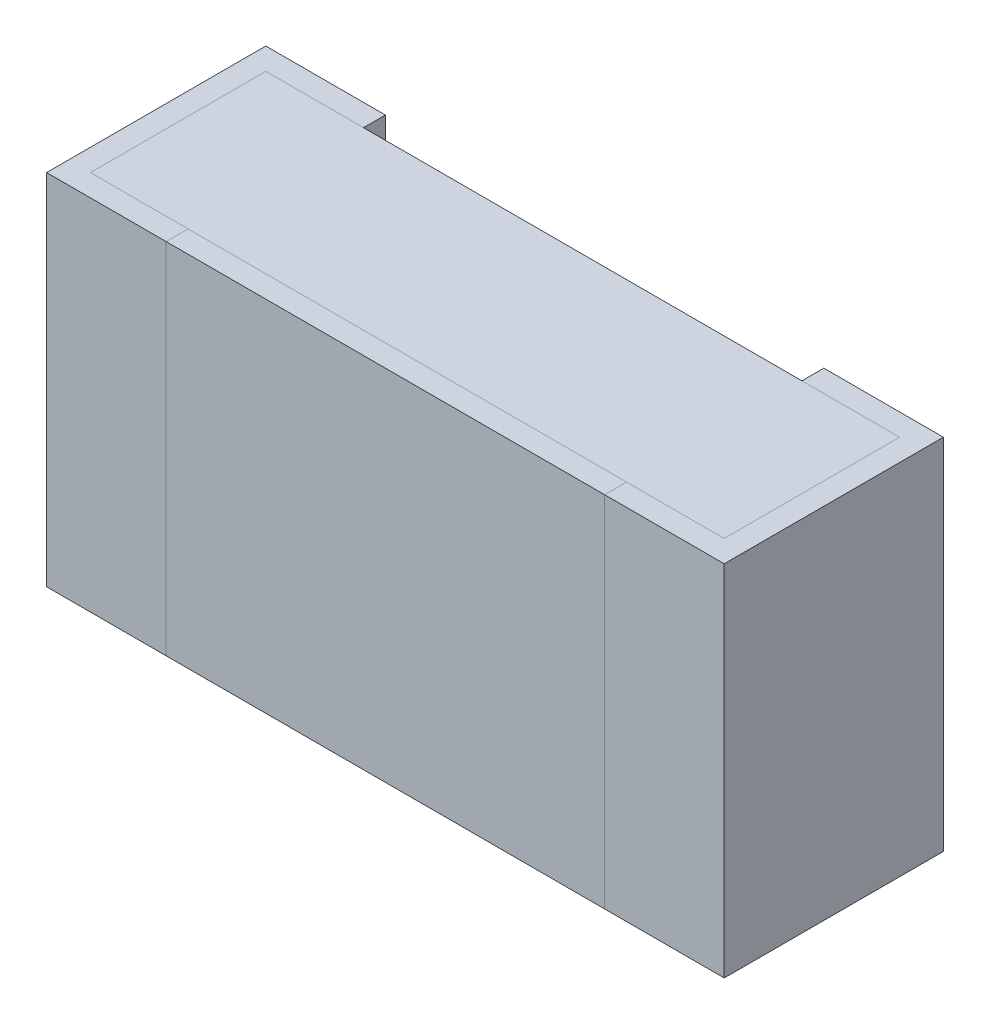
ISO-10303-21;
HEADER;
FILE_DESCRIPTION(('STEP AP214'),'2;1');
FILE_NAME('part.step','',(''),(''),'','','');
FILE_SCHEMA(('AUTOMOTIVE_DESIGN { 1 0 10303 214 1 1 1 1 }'));
ENDSEC;
DATA;
#1=APPLICATION_CONTEXT('core data for automotive mechanical design processes');
#2=APPLICATION_PROTOCOL_DEFINITION('international standard','automotive_design',2000,#1);
#3=PRODUCT_CONTEXT('',#1,'mechanical');
#4=PRODUCT('Part','Part','',(#3));
#5=PRODUCT_RELATED_PRODUCT_CATEGORY('part','',(#4));
#6=PRODUCT_DEFINITION_FORMATION('','',#4);
#7=PRODUCT_DEFINITION_CONTEXT('part definition',#1,'design');
#8=PRODUCT_DEFINITION('design','',#6,#7);
#9=PRODUCT_DEFINITION_SHAPE('','',#8);
#10=(LENGTH_UNIT() NAMED_UNIT(*) SI_UNIT(.MILLI.,.METRE.));
#11=(NAMED_UNIT(*) PLANE_ANGLE_UNIT() SI_UNIT($,.RADIAN.));
#12=(NAMED_UNIT(*) SI_UNIT($,.STERADIAN.) SOLID_ANGLE_UNIT());
#13=UNCERTAINTY_MEASURE_WITH_UNIT(LENGTH_MEASURE(1.E-05),#10,'distance_accuracy_value','');
#14=(GEOMETRIC_REPRESENTATION_CONTEXT(3) GLOBAL_UNCERTAINTY_ASSIGNED_CONTEXT((#13)) GLOBAL_UNIT_ASSIGNED_CONTEXT((#10,
#11,#12)) REPRESENTATION_CONTEXT('',''));
#15=CARTESIAN_POINT('',(0.,0.,0.));
#16=DIRECTION('',(0.,0.,1.));
#17=DIRECTION('',(1.,0.,0.));
#18=AXIS2_PLACEMENT_3D('',#15,#16,#17);
#19=CARTESIAN_POINT('',(-0.795,-0.45,0.055));
#20=DIRECTION('',(1.,0.,0.));
#21=DIRECTION('',(0.,0.,1.));
#22=AXIS2_PLACEMENT_3D('',#19,#20,#21);
#23=PLANE('',#22);
#24=DIRECTION('',(0.,1.,0.));
#25=VECTOR('',#24,1.);
#26=CARTESIAN_POINT('',(-0.795,-0.45,0.495));
#27=LINE('',#26,#25);
#28=CARTESIAN_POINT('',(-0.795,-0.45,0.495));
#29=VERTEX_POINT('',#28);
#30=CARTESIAN_POINT('',(-0.795,0.45,0.495));
#31=VERTEX_POINT('',#30);
#32=EDGE_CURVE('P0_E11',#29,#31,#27,.T.);
#33=ORIENTED_EDGE('',*,*,#32,.T.);
#34=DIRECTION('',(0.,0.,1.));
#35=VECTOR('',#34,1.);
#36=CARTESIAN_POINT('',(-0.795,0.45,0.055));
#37=LINE('',#36,#35);
#38=CARTESIAN_POINT('',(-0.795,0.45,0.055));
#39=VERTEX_POINT('',#38);
#40=EDGE_CURVE('P0_E24',#39,#31,#37,.T.);
#41=ORIENTED_EDGE('',*,*,#40,.F.);
#42=DIRECTION('',(0.,1.,0.));
#43=VECTOR('',#42,1.);
#44=CARTESIAN_POINT('',(-0.795,-0.45,0.055));
#45=LINE('',#44,#43);
#46=CARTESIAN_POINT('',(-0.795,-0.45,0.055));
#47=VERTEX_POINT('',#46);
#48=EDGE_CURVE('P0_E86',#47,#39,#45,.T.);
#49=ORIENTED_EDGE('',*,*,#48,.F.);
#50=DIRECTION('',(0.,0.,1.));
#51=VECTOR('',#50,1.);
#52=CARTESIAN_POINT('',(-0.795,-0.45,0.055));
#53=LINE('',#52,#51);
#54=EDGE_CURVE('P0_E36',#47,#29,#53,.T.);
#55=ORIENTED_EDGE('',*,*,#54,.T.);
#56=EDGE_LOOP('',(#33,#41,#49,#55));
#57=FACE_BOUND('',#56,.T.);
#58=ADVANCED_FACE('P0_F17',(#57),#23,.F.);
#59=CARTESIAN_POINT('',(0.795,-0.45,0.055));
#60=DIRECTION('',(1.,0.,0.));
#61=DIRECTION('',(0.,0.,1.));
#62=AXIS2_PLACEMENT_3D('',#59,#60,#61);
#63=PLANE('',#62);
#64=DIRECTION('',(0.,0.,1.));
#65=VECTOR('',#64,1.);
#66=CARTESIAN_POINT('',(0.795,-0.45,0.055));
#67=LINE('',#66,#65);
#68=CARTESIAN_POINT('',(0.795,-0.45,0.055));
#69=VERTEX_POINT('',#68);
#70=CARTESIAN_POINT('',(0.795,-0.45,0.495));
#71=VERTEX_POINT('',#70);
#72=EDGE_CURVE('P0_E83',#69,#71,#67,.T.);
#73=ORIENTED_EDGE('',*,*,#72,.F.);
#74=DIRECTION('',(0.,1.,0.));
#75=VECTOR('',#74,1.);
#76=CARTESIAN_POINT('',(0.795,-0.45,0.055));
#77=LINE('',#76,#75);
#78=CARTESIAN_POINT('',(0.795,0.45,0.055));
#79=VERTEX_POINT('',#78);
#80=EDGE_CURVE('P0_E63',#69,#79,#77,.T.);
#81=ORIENTED_EDGE('',*,*,#80,.T.);
#82=DIRECTION('',(0.,0.,1.));
#83=VECTOR('',#82,1.);
#84=CARTESIAN_POINT('',(0.795,0.45,0.055));
#85=LINE('',#84,#83);
#86=CARTESIAN_POINT('',(0.795,0.45,0.495));
#87=VERTEX_POINT('',#86);
#88=EDGE_CURVE('P0_E57',#79,#87,#85,.T.);
#89=ORIENTED_EDGE('',*,*,#88,.T.);
#90=DIRECTION('',(0.,1.,0.));
#91=VECTOR('',#90,1.);
#92=CARTESIAN_POINT('',(0.795,-0.45,0.495));
#93=LINE('',#92,#91);
#94=EDGE_CURVE('P0_E60',#71,#87,#93,.T.);
#95=ORIENTED_EDGE('',*,*,#94,.F.);
#96=EDGE_LOOP('',(#73,#81,#89,#95));
#97=FACE_BOUND('',#96,.T.);
#98=ADVANCED_FACE('P0_F59',(#97),#63,.T.);
#99=CARTESIAN_POINT('',(-0.795,-0.45,0.055));
#100=DIRECTION('',(0.,1.,0.));
#101=DIRECTION('',(0.,0.,1.));
#102=AXIS2_PLACEMENT_3D('',#99,#100,#101);
#103=PLANE('',#102);
#104=ORIENTED_EDGE('',*,*,#72,.T.);
#105=DIRECTION('',(1.,0.,0.));
#106=VECTOR('',#105,1.);
#107=CARTESIAN_POINT('',(-0.795,-0.45,0.495));
#108=LINE('',#107,#106);
#109=EDGE_CURVE('P0_E71',#29,#71,#108,.T.);
#110=ORIENTED_EDGE('',*,*,#109,.F.);
#111=ORIENTED_EDGE('',*,*,#54,.F.);
#112=DIRECTION('',(1.,0.,0.));
#113=VECTOR('',#112,1.);
#114=CARTESIAN_POINT('',(-0.795,-0.45,0.055));
#115=LINE('',#114,#113);
#116=EDGE_CURVE('P0_E76',#47,#69,#115,.T.);
#117=ORIENTED_EDGE('',*,*,#116,.T.);
#118=EDGE_LOOP('',(#104,#110,#111,#117));
#119=FACE_BOUND('',#118,.T.);
#120=ADVANCED_FACE('P0_F91',(#119),#103,.F.);
#121=CARTESIAN_POINT('',(-0.795,0.45,0.055));
#122=DIRECTION('',(0.,1.,0.));
#123=DIRECTION('',(0.,0.,1.));
#124=AXIS2_PLACEMENT_3D('',#121,#122,#123);
#125=PLANE('',#124);
#126=DIRECTION('',(1.,0.,0.));
#127=VECTOR('',#126,1.);
#128=CARTESIAN_POINT('',(-0.795,0.45,0.055));
#129=LINE('',#128,#127);
#130=EDGE_CURVE('P0_E74',#39,#79,#129,.T.);
#131=ORIENTED_EDGE('',*,*,#130,.F.);
#132=ORIENTED_EDGE('',*,*,#40,.T.);
#133=DIRECTION('',(1.,0.,0.));
#134=VECTOR('',#133,1.);
#135=CARTESIAN_POINT('',(-0.795,0.45,0.495));
#136=LINE('',#135,#134);
#137=EDGE_CURVE('P0_E69',#31,#87,#136,.T.);
#138=ORIENTED_EDGE('',*,*,#137,.T.);
#139=ORIENTED_EDGE('',*,*,#88,.F.);
#140=EDGE_LOOP('',(#131,#132,#138,#139));
#141=FACE_BOUND('',#140,.T.);
#142=ADVANCED_FACE('P0_F73',(#141),#125,.T.);
#143=CARTESIAN_POINT('',(-0.795,-0.45,0.055));
#144=DIRECTION('',(0.,0.,1.));
#145=DIRECTION('',(1.,0.,0.));
#146=AXIS2_PLACEMENT_3D('',#143,#144,#145);
#147=PLANE('',#146);
#148=ORIENTED_EDGE('',*,*,#130,.T.);
#149=ORIENTED_EDGE('',*,*,#80,.F.);
#150=ORIENTED_EDGE('',*,*,#116,.F.);
#151=ORIENTED_EDGE('',*,*,#48,.T.);
#152=EDGE_LOOP('',(#148,#149,#150,#151));
#153=FACE_BOUND('',#152,.T.);
#154=ADVANCED_FACE('P0_F89',(#153),#147,.F.);
#155=CARTESIAN_POINT('',(-0.795,-0.45,0.495));
#156=DIRECTION('',(0.,0.,1.));
#157=DIRECTION('',(1.,0.,0.));
#158=AXIS2_PLACEMENT_3D('',#155,#156,#157);
#159=PLANE('',#158);
#160=ORIENTED_EDGE('',*,*,#32,.F.);
#161=ORIENTED_EDGE('',*,*,#109,.T.);
#162=ORIENTED_EDGE('',*,*,#94,.T.);
#163=ORIENTED_EDGE('',*,*,#137,.F.);
#164=EDGE_LOOP('',(#160,#161,#162,#163));
#165=FACE_BOUND('',#164,.T.);
#166=ADVANCED_FACE('P0_F68',(#165),#159,.T.);
#167=CLOSED_SHELL('',(#58,#98,#120,#142,#154,#166));
#168=MANIFOLD_SOLID_BREP('P0_B1',#167);
#169=CARTESIAN_POINT('',(-0.85,-0.45,0.));
#170=DIRECTION('',(1.,0.,0.));
#171=DIRECTION('',(0.,0.,1.));
#172=AXIS2_PLACEMENT_3D('',#169,#170,#171);
#173=PLANE('',#172);
#174=DIRECTION('',(0.,1.,0.));
#175=VECTOR('',#174,1.);
#176=CARTESIAN_POINT('',(-0.85,-0.45,0.55));
#177=LINE('',#176,#175);
#178=CARTESIAN_POINT('',(-0.85,-0.45,0.55));
#179=VERTEX_POINT('',#178);
#180=CARTESIAN_POINT('',(-0.85,0.45,0.55));
#181=VERTEX_POINT('',#180);
#182=EDGE_CURVE('P1_E11',#179,#181,#177,.T.);
#183=ORIENTED_EDGE('',*,*,#182,.T.);
#184=DIRECTION('',(0.,0.,1.));
#185=VECTOR('',#184,1.);
#186=CARTESIAN_POINT('',(-0.85,0.45,0.));
#187=LINE('',#186,#185);
#188=CARTESIAN_POINT('',(-0.85,0.45,0.));
#189=VERTEX_POINT('',#188);
#190=EDGE_CURVE('P1_E24',#189,#181,#187,.T.);
#191=ORIENTED_EDGE('',*,*,#190,.F.);
#192=DIRECTION('',(0.,1.,0.));
#193=VECTOR('',#192,1.);
#194=CARTESIAN_POINT('',(-0.85,-0.45,0.));
#195=LINE('',#194,#193);
#196=CARTESIAN_POINT('',(-0.85,-0.45,0.));
#197=VERTEX_POINT('',#196);
#198=EDGE_CURVE('P1_E144',#197,#189,#195,.T.);
#199=ORIENTED_EDGE('',*,*,#198,.F.);
#200=DIRECTION('',(0.,0.,1.));
#201=VECTOR('',#200,1.);
#202=CARTESIAN_POINT('',(-0.85,-0.45,0.));
#203=LINE('',#202,#201);
#204=EDGE_CURVE('P1_E36',#197,#179,#203,.T.);
#205=ORIENTED_EDGE('',*,*,#204,.T.);
#206=EDGE_LOOP('',(#183,#191,#199,#205));
#207=FACE_BOUND('',#206,.T.);
#208=ADVANCED_FACE('P1_F17',(#207),#173,.F.);
#209=CARTESIAN_POINT('',(-0.85,-0.45,0.));
#210=DIRECTION('',(0.,1.,0.));
#211=DIRECTION('',(0.,0.,1.));
#212=AXIS2_PLACEMENT_3D('',#209,#210,#211);
#213=PLANE('',#212);
#214=DIRECTION('',(1.,0.,0.));
#215=VECTOR('',#214,1.);
#216=CARTESIAN_POINT('',(-0.795,-0.45,0.055));
#217=LINE('',#216,#215);
#218=CARTESIAN_POINT('',(-0.795,-0.45,0.055));
#219=VERTEX_POINT('',#218);
#220=CARTESIAN_POINT('',(-0.55,-0.45,0.055));
#221=VERTEX_POINT('',#220);
#222=EDGE_CURVE('P1_E141',#219,#221,#217,.T.);
#223=ORIENTED_EDGE('',*,*,#222,.F.);
#224=DIRECTION('',(0.,0.,1.));
#225=VECTOR('',#224,1.);
#226=CARTESIAN_POINT('',(-0.795,-0.45,0.055));
#227=LINE('',#226,#225);
#228=CARTESIAN_POINT('',(-0.795,-0.45,0.495));
#229=VERTEX_POINT('',#228);
#230=EDGE_CURVE('P1_E103',#219,#229,#227,.T.);
#231=ORIENTED_EDGE('',*,*,#230,.T.);
#232=DIRECTION('',(1.,0.,0.));
#233=VECTOR('',#232,1.);
#234=CARTESIAN_POINT('',(-0.795,-0.45,0.495));
#235=LINE('',#234,#233);
#236=CARTESIAN_POINT('',(-0.55,-0.45,0.495));
#237=VERTEX_POINT('',#236);
#238=EDGE_CURVE('P1_E137',#229,#237,#235,.T.);
#239=ORIENTED_EDGE('',*,*,#238,.T.);
#240=DIRECTION('',(0.,0.,1.));
#241=VECTOR('',#240,1.);
#242=CARTESIAN_POINT('',(-0.55,-0.45,0.));
#243=LINE('',#242,#241);
#244=CARTESIAN_POINT('',(-0.55,-0.45,0.55));
#245=VERTEX_POINT('',#244);
#246=EDGE_CURVE('P1_E134',#237,#245,#243,.T.);
#247=ORIENTED_EDGE('',*,*,#246,.T.);
#248=DIRECTION('',(1.,0.,0.));
#249=VECTOR('',#248,1.);
#250=CARTESIAN_POINT('',(-0.85,-0.45,0.55));
#251=LINE('',#250,#249);
#252=EDGE_CURVE('P1_E132',#179,#245,#251,.T.);
#253=ORIENTED_EDGE('',*,*,#252,.F.);
#254=ORIENTED_EDGE('',*,*,#204,.F.);
#255=DIRECTION('',(1.,0.,0.));
#256=VECTOR('',#255,1.);
#257=CARTESIAN_POINT('',(-0.85,-0.45,0.));
#258=LINE('',#257,#256);
#259=CARTESIAN_POINT('',(-0.55,-0.45,0.));
#260=VERTEX_POINT('',#259);
#261=EDGE_CURVE('P1_E129',#197,#260,#258,.T.);
#262=ORIENTED_EDGE('',*,*,#261,.T.);
#263=DIRECTION('',(0.,0.,1.));
#264=VECTOR('',#263,1.);
#265=CARTESIAN_POINT('',(-0.55,-0.45,0.));
#266=LINE('',#265,#264);
#267=EDGE_CURVE('P1_E127',#260,#221,#266,.T.);
#268=ORIENTED_EDGE('',*,*,#267,.T.);
#269=EDGE_LOOP('',(#223,#231,#239,#247,#253,#254,#262,#268));
#270=FACE_BOUND('',#269,.T.);
#271=ADVANCED_FACE('P1_F153',(#270),#213,.F.);
#272=CARTESIAN_POINT('',(-0.85,-0.45,0.55));
#273=DIRECTION('',(0.,0.,1.));
#274=DIRECTION('',(1.,0.,0.));
#275=AXIS2_PLACEMENT_3D('',#272,#273,#274);
#276=PLANE('',#275);
#277=ORIENTED_EDGE('',*,*,#182,.F.);
#278=ORIENTED_EDGE('',*,*,#252,.T.);
#279=DIRECTION('',(0.,1.,0.));
#280=VECTOR('',#279,1.);
#281=CARTESIAN_POINT('',(-0.55,-0.45,0.55));
#282=LINE('',#281,#280);
#283=CARTESIAN_POINT('',(-0.55,0.45,0.55));
#284=VERTEX_POINT('',#283);
#285=EDGE_CURVE('P1_E125',#245,#284,#282,.T.);
#286=ORIENTED_EDGE('',*,*,#285,.T.);
#287=DIRECTION('',(1.,0.,0.));
#288=VECTOR('',#287,1.);
#289=CARTESIAN_POINT('',(-0.85,0.45,0.55));
#290=LINE('',#289,#288);
#291=EDGE_CURVE('P1_E123',#181,#284,#290,.T.);
#292=ORIENTED_EDGE('',*,*,#291,.F.);
#293=EDGE_LOOP('',(#277,#278,#286,#292));
#294=FACE_BOUND('',#293,.T.);
#295=ADVANCED_FACE('P1_F157',(#294),#276,.T.);
#296=CARTESIAN_POINT('',(-0.85,0.45,0.));
#297=DIRECTION('',(0.,1.,0.));
#298=DIRECTION('',(0.,0.,1.));
#299=AXIS2_PLACEMENT_3D('',#296,#297,#298);
#300=PLANE('',#299);
#301=DIRECTION('',(0.,0.,1.));
#302=VECTOR('',#301,1.);
#303=CARTESIAN_POINT('',(-0.55,0.45,0.));
#304=LINE('',#303,#302);
#305=CARTESIAN_POINT('',(-0.55,0.45,0.));
#306=VERTEX_POINT('',#305);
#307=CARTESIAN_POINT('',(-0.55,0.45,0.055));
#308=VERTEX_POINT('',#307);
#309=EDGE_CURVE('P1_E121',#306,#308,#304,.T.);
#310=ORIENTED_EDGE('',*,*,#309,.F.);
#311=DIRECTION('',(1.,0.,0.));
#312=VECTOR('',#311,1.);
#313=CARTESIAN_POINT('',(-0.85,0.45,0.));
#314=LINE('',#313,#312);
#315=EDGE_CURVE('P1_E118',#189,#306,#314,.T.);
#316=ORIENTED_EDGE('',*,*,#315,.F.);
#317=ORIENTED_EDGE('',*,*,#190,.T.);
#318=ORIENTED_EDGE('',*,*,#291,.T.);
#319=DIRECTION('',(0.,0.,1.));
#320=VECTOR('',#319,1.);
#321=CARTESIAN_POINT('',(-0.55,0.45,0.));
#322=LINE('',#321,#320);
#323=CARTESIAN_POINT('',(-0.55,0.45,0.495));
#324=VERTEX_POINT('',#323);
#325=EDGE_CURVE('P1_E115',#324,#284,#322,.T.);
#326=ORIENTED_EDGE('',*,*,#325,.F.);
#327=DIRECTION('',(1.,0.,0.));
#328=VECTOR('',#327,1.);
#329=CARTESIAN_POINT('',(-0.795,0.45,0.495));
#330=LINE('',#329,#328);
#331=CARTESIAN_POINT('',(-0.795,0.45,0.495));
#332=VERTEX_POINT('',#331);
#333=EDGE_CURVE('P1_E86',#332,#324,#330,.T.);
#334=ORIENTED_EDGE('',*,*,#333,.F.);
#335=DIRECTION('',(0.,0.,1.));
#336=VECTOR('',#335,1.);
#337=CARTESIAN_POINT('',(-0.795,0.45,0.055));
#338=LINE('',#337,#336);
#339=CARTESIAN_POINT('',(-0.795,0.45,0.055));
#340=VERTEX_POINT('',#339);
#341=EDGE_CURVE('P1_E80',#340,#332,#338,.T.);
#342=ORIENTED_EDGE('',*,*,#341,.F.);
#343=DIRECTION('',(1.,0.,0.));
#344=VECTOR('',#343,1.);
#345=CARTESIAN_POINT('',(-0.795,0.45,0.055));
#346=LINE('',#345,#344);
#347=EDGE_CURVE('P1_E83',#340,#308,#346,.T.);
#348=ORIENTED_EDGE('',*,*,#347,.T.);
#349=EDGE_LOOP('',(#310,#316,#317,#318,#326,#334,#342,#348));
#350=FACE_BOUND('',#349,.T.);
#351=ADVANCED_FACE('P1_F82',(#350),#300,.T.);
#352=CARTESIAN_POINT('',(-0.85,-0.45,0.));
#353=DIRECTION('',(0.,0.,1.));
#354=DIRECTION('',(1.,0.,0.));
#355=AXIS2_PLACEMENT_3D('',#352,#353,#354);
#356=PLANE('',#355);
#357=ORIENTED_EDGE('',*,*,#315,.T.);
#358=DIRECTION('',(0.,1.,0.));
#359=VECTOR('',#358,1.);
#360=CARTESIAN_POINT('',(-0.55,-0.45,0.));
#361=LINE('',#360,#359);
#362=EDGE_CURVE('P1_E99',#260,#306,#361,.T.);
#363=ORIENTED_EDGE('',*,*,#362,.F.);
#364=ORIENTED_EDGE('',*,*,#261,.F.);
#365=ORIENTED_EDGE('',*,*,#198,.T.);
#366=EDGE_LOOP('',(#357,#363,#364,#365));
#367=FACE_BOUND('',#366,.T.);
#368=ADVANCED_FACE('P1_F147',(#367),#356,.F.);
#369=CARTESIAN_POINT('',(-0.55,-0.45,0.));
#370=DIRECTION('',(1.,0.,0.));
#371=DIRECTION('',(0.,0.,1.));
#372=AXIS2_PLACEMENT_3D('',#369,#370,#371);
#373=PLANE('',#372);
#374=ORIENTED_EDGE('',*,*,#267,.F.);
#375=ORIENTED_EDGE('',*,*,#362,.T.);
#376=ORIENTED_EDGE('',*,*,#309,.T.);
#377=DIRECTION('',(0.,-1.,0.));
#378=VECTOR('',#377,1.);
#379=CARTESIAN_POINT('',(-0.55,-0.45,0.055));
#380=LINE('',#379,#378);
#381=EDGE_CURVE('P1_E98',#308,#221,#380,.T.);
#382=ORIENTED_EDGE('',*,*,#381,.T.);
#383=EDGE_LOOP('',(#374,#375,#376,#382));
#384=FACE_BOUND('',#383,.T.);
#385=ADVANCED_FACE('P1_F151',(#384),#373,.T.);
#386=CARTESIAN_POINT('',(-0.795,-0.45,0.055));
#387=DIRECTION('',(0.,0.,1.));
#388=DIRECTION('',(1.,0.,0.));
#389=AXIS2_PLACEMENT_3D('',#386,#387,#388);
#390=PLANE('',#389);
#391=ORIENTED_EDGE('',*,*,#347,.F.);
#392=DIRECTION('',(0.,1.,0.));
#393=VECTOR('',#392,1.);
#394=CARTESIAN_POINT('',(-0.795,-0.45,0.055));
#395=LINE('',#394,#393);
#396=EDGE_CURVE('P1_E96',#219,#340,#395,.T.);
#397=ORIENTED_EDGE('',*,*,#396,.F.);
#398=ORIENTED_EDGE('',*,*,#222,.T.);
#399=ORIENTED_EDGE('',*,*,#381,.F.);
#400=EDGE_LOOP('',(#391,#397,#398,#399));
#401=FACE_BOUND('',#400,.T.);
#402=ADVANCED_FACE('P1_F94',(#401),#390,.T.);
#403=CARTESIAN_POINT('',(-0.795,-0.45,0.055));
#404=DIRECTION('',(1.,0.,0.));
#405=DIRECTION('',(0.,0.,1.));
#406=AXIS2_PLACEMENT_3D('',#403,#404,#405);
#407=PLANE('',#406);
#408=ORIENTED_EDGE('',*,*,#230,.F.);
#409=ORIENTED_EDGE('',*,*,#396,.T.);
#410=ORIENTED_EDGE('',*,*,#341,.T.);
#411=DIRECTION('',(0.,1.,0.));
#412=VECTOR('',#411,1.);
#413=CARTESIAN_POINT('',(-0.795,-0.45,0.495));
#414=LINE('',#413,#412);
#415=EDGE_CURVE('P1_E105',#229,#332,#414,.T.);
#416=ORIENTED_EDGE('',*,*,#415,.F.);
#417=EDGE_LOOP('',(#408,#409,#410,#416));
#418=FACE_BOUND('',#417,.T.);
#419=ADVANCED_FACE('P1_F101',(#418),#407,.T.);
#420=CARTESIAN_POINT('',(-0.795,-0.45,0.495));
#421=DIRECTION('',(0.,0.,1.));
#422=DIRECTION('',(1.,0.,0.));
#423=AXIS2_PLACEMENT_3D('',#420,#421,#422);
#424=PLANE('',#423);
#425=DIRECTION('',(0.,-1.,0.));
#426=VECTOR('',#425,1.);
#427=CARTESIAN_POINT('',(-0.55,-0.45,0.495));
#428=LINE('',#427,#426);
#429=EDGE_CURVE('P1_E108',#324,#237,#428,.T.);
#430=ORIENTED_EDGE('',*,*,#429,.T.);
#431=ORIENTED_EDGE('',*,*,#238,.F.);
#432=ORIENTED_EDGE('',*,*,#415,.T.);
#433=ORIENTED_EDGE('',*,*,#333,.T.);
#434=EDGE_LOOP('',(#430,#431,#432,#433));
#435=FACE_BOUND('',#434,.T.);
#436=ADVANCED_FACE('P1_F163',(#435),#424,.F.);
#437=CARTESIAN_POINT('',(-0.55,-0.45,0.));
#438=DIRECTION('',(1.,0.,0.));
#439=DIRECTION('',(0.,0.,1.));
#440=AXIS2_PLACEMENT_3D('',#437,#438,#439);
#441=PLANE('',#440);
#442=ORIENTED_EDGE('',*,*,#246,.F.);
#443=ORIENTED_EDGE('',*,*,#429,.F.);
#444=ORIENTED_EDGE('',*,*,#325,.T.);
#445=ORIENTED_EDGE('',*,*,#285,.F.);
#446=EDGE_LOOP('',(#442,#443,#444,#445));
#447=FACE_BOUND('',#446,.T.);
#448=ADVANCED_FACE('P1_F160',(#447),#441,.T.);
#449=CLOSED_SHELL('',(#208,#271,#295,#351,#368,#385,#402,#419,#436,#448));
#450=MANIFOLD_SOLID_BREP('P1_B1',#449);
#451=CARTESIAN_POINT('',(0.85,0.45,0.));
#452=DIRECTION('',(-1.,0.,0.));
#453=DIRECTION('',(0.,0.,1.));
#454=AXIS2_PLACEMENT_3D('',#451,#452,#453);
#455=PLANE('',#454);
#456=DIRECTION('',(0.,-1.,0.));
#457=VECTOR('',#456,1.);
#458=CARTESIAN_POINT('',(0.85,0.45,0.55));
#459=LINE('',#458,#457);
#460=CARTESIAN_POINT('',(0.85,0.45,0.55));
#461=VERTEX_POINT('',#460);
#462=CARTESIAN_POINT('',(0.85,-0.45,0.55));
#463=VERTEX_POINT('',#462);
#464=EDGE_CURVE('P2_E11',#461,#463,#459,.T.);
#465=ORIENTED_EDGE('',*,*,#464,.T.);
#466=DIRECTION('',(0.,0.,1.));
#467=VECTOR('',#466,1.);
#468=CARTESIAN_POINT('',(0.85,-0.45,0.));
#469=LINE('',#468,#467);
#470=CARTESIAN_POINT('',(0.85,-0.45,0.));
#471=VERTEX_POINT('',#470);
#472=EDGE_CURVE('P2_E24',#471,#463,#469,.T.);
#473=ORIENTED_EDGE('',*,*,#472,.F.);
#474=DIRECTION('',(0.,-1.,0.));
#475=VECTOR('',#474,1.);
#476=CARTESIAN_POINT('',(0.85,0.45,0.));
#477=LINE('',#476,#475);
#478=CARTESIAN_POINT('',(0.85,0.45,0.));
#479=VERTEX_POINT('',#478);
#480=EDGE_CURVE('P2_E144',#479,#471,#477,.T.);
#481=ORIENTED_EDGE('',*,*,#480,.F.);
#482=DIRECTION('',(0.,0.,1.));
#483=VECTOR('',#482,1.);
#484=CARTESIAN_POINT('',(0.85,0.45,0.));
#485=LINE('',#484,#483);
#486=EDGE_CURVE('P2_E36',#479,#461,#485,.T.);
#487=ORIENTED_EDGE('',*,*,#486,.T.);
#488=EDGE_LOOP('',(#465,#473,#481,#487));
#489=FACE_BOUND('',#488,.T.);
#490=ADVANCED_FACE('P2_F17',(#489),#455,.F.);
#491=CARTESIAN_POINT('',(0.85,0.45,0.));
#492=DIRECTION('',(0.,-1.,0.));
#493=DIRECTION('',(0.,0.,1.));
#494=AXIS2_PLACEMENT_3D('',#491,#492,#493);
#495=PLANE('',#494);
#496=DIRECTION('',(-1.,0.,0.));
#497=VECTOR('',#496,1.);
#498=CARTESIAN_POINT('',(0.795,0.45,0.055));
#499=LINE('',#498,#497);
#500=CARTESIAN_POINT('',(0.795,0.45,0.055));
#501=VERTEX_POINT('',#500);
#502=CARTESIAN_POINT('',(0.55,0.45,0.055));
#503=VERTEX_POINT('',#502);
#504=EDGE_CURVE('P2_E141',#501,#503,#499,.T.);
#505=ORIENTED_EDGE('',*,*,#504,.F.);
#506=DIRECTION('',(0.,0.,1.));
#507=VECTOR('',#506,1.);
#508=CARTESIAN_POINT('',(0.795,0.45,0.055));
#509=LINE('',#508,#507);
#510=CARTESIAN_POINT('',(0.795,0.45,0.495));
#511=VERTEX_POINT('',#510);
#512=EDGE_CURVE('P2_E103',#501,#511,#509,.T.);
#513=ORIENTED_EDGE('',*,*,#512,.T.);
#514=DIRECTION('',(-1.,0.,0.));
#515=VECTOR('',#514,1.);
#516=CARTESIAN_POINT('',(0.795,0.45,0.495));
#517=LINE('',#516,#515);
#518=CARTESIAN_POINT('',(0.55,0.45,0.495));
#519=VERTEX_POINT('',#518);
#520=EDGE_CURVE('P2_E137',#511,#519,#517,.T.);
#521=ORIENTED_EDGE('',*,*,#520,.T.);
#522=DIRECTION('',(0.,0.,1.));
#523=VECTOR('',#522,1.);
#524=CARTESIAN_POINT('',(0.55,0.45,0.));
#525=LINE('',#524,#523);
#526=CARTESIAN_POINT('',(0.55,0.45,0.55));
#527=VERTEX_POINT('',#526);
#528=EDGE_CURVE('P2_E134',#519,#527,#525,.T.);
#529=ORIENTED_EDGE('',*,*,#528,.T.);
#530=DIRECTION('',(-1.,0.,0.));
#531=VECTOR('',#530,1.);
#532=CARTESIAN_POINT('',(0.85,0.45,0.55));
#533=LINE('',#532,#531);
#534=EDGE_CURVE('P2_E132',#461,#527,#533,.T.);
#535=ORIENTED_EDGE('',*,*,#534,.F.);
#536=ORIENTED_EDGE('',*,*,#486,.F.);
#537=DIRECTION('',(-1.,0.,0.));
#538=VECTOR('',#537,1.);
#539=CARTESIAN_POINT('',(0.85,0.45,0.));
#540=LINE('',#539,#538);
#541=CARTESIAN_POINT('',(0.55,0.45,0.));
#542=VERTEX_POINT('',#541);
#543=EDGE_CURVE('P2_E129',#479,#542,#540,.T.);
#544=ORIENTED_EDGE('',*,*,#543,.T.);
#545=DIRECTION('',(0.,0.,1.));
#546=VECTOR('',#545,1.);
#547=CARTESIAN_POINT('',(0.55,0.45,0.));
#548=LINE('',#547,#546);
#549=EDGE_CURVE('P2_E127',#542,#503,#548,.T.);
#550=ORIENTED_EDGE('',*,*,#549,.T.);
#551=EDGE_LOOP('',(#505,#513,#521,#529,#535,#536,#544,#550));
#552=FACE_BOUND('',#551,.T.);
#553=ADVANCED_FACE('P2_F153',(#552),#495,.F.);
#554=CARTESIAN_POINT('',(0.85,0.45,0.55));
#555=DIRECTION('',(0.,0.,1.));
#556=DIRECTION('',(-1.,0.,0.));
#557=AXIS2_PLACEMENT_3D('',#554,#555,#556);
#558=PLANE('',#557);
#559=ORIENTED_EDGE('',*,*,#464,.F.);
#560=ORIENTED_EDGE('',*,*,#534,.T.);
#561=DIRECTION('',(0.,-1.,0.));
#562=VECTOR('',#561,1.);
#563=CARTESIAN_POINT('',(0.55,0.45,0.55));
#564=LINE('',#563,#562);
#565=CARTESIAN_POINT('',(0.55,-0.45,0.55));
#566=VERTEX_POINT('',#565);
#567=EDGE_CURVE('P2_E125',#527,#566,#564,.T.);
#568=ORIENTED_EDGE('',*,*,#567,.T.);
#569=DIRECTION('',(-1.,0.,0.));
#570=VECTOR('',#569,1.);
#571=CARTESIAN_POINT('',(0.85,-0.45,0.55));
#572=LINE('',#571,#570);
#573=EDGE_CURVE('P2_E123',#463,#566,#572,.T.);
#574=ORIENTED_EDGE('',*,*,#573,.F.);
#575=EDGE_LOOP('',(#559,#560,#568,#574));
#576=FACE_BOUND('',#575,.T.);
#577=ADVANCED_FACE('P2_F157',(#576),#558,.T.);
#578=CARTESIAN_POINT('',(0.85,-0.45,0.));
#579=DIRECTION('',(0.,-1.,0.));
#580=DIRECTION('',(0.,0.,1.));
#581=AXIS2_PLACEMENT_3D('',#578,#579,#580);
#582=PLANE('',#581);
#583=DIRECTION('',(0.,0.,1.));
#584=VECTOR('',#583,1.);
#585=CARTESIAN_POINT('',(0.55,-0.45,0.));
#586=LINE('',#585,#584);
#587=CARTESIAN_POINT('',(0.55,-0.45,0.));
#588=VERTEX_POINT('',#587);
#589=CARTESIAN_POINT('',(0.55,-0.45,0.055));
#590=VERTEX_POINT('',#589);
#591=EDGE_CURVE('P2_E121',#588,#590,#586,.T.);
#592=ORIENTED_EDGE('',*,*,#591,.F.);
#593=DIRECTION('',(-1.,0.,0.));
#594=VECTOR('',#593,1.);
#595=CARTESIAN_POINT('',(0.85,-0.45,0.));
#596=LINE('',#595,#594);
#597=EDGE_CURVE('P2_E118',#471,#588,#596,.T.);
#598=ORIENTED_EDGE('',*,*,#597,.F.);
#599=ORIENTED_EDGE('',*,*,#472,.T.);
#600=ORIENTED_EDGE('',*,*,#573,.T.);
#601=DIRECTION('',(0.,0.,1.));
#602=VECTOR('',#601,1.);
#603=CARTESIAN_POINT('',(0.55,-0.45,0.));
#604=LINE('',#603,#602);
#605=CARTESIAN_POINT('',(0.55,-0.45,0.495));
#606=VERTEX_POINT('',#605);
#607=EDGE_CURVE('P2_E115',#606,#566,#604,.T.);
#608=ORIENTED_EDGE('',*,*,#607,.F.);
#609=DIRECTION('',(-1.,0.,0.));
#610=VECTOR('',#609,1.);
#611=CARTESIAN_POINT('',(0.795,-0.45,0.495));
#612=LINE('',#611,#610);
#613=CARTESIAN_POINT('',(0.795,-0.45,0.495));
#614=VERTEX_POINT('',#613);
#615=EDGE_CURVE('P2_E86',#614,#606,#612,.T.);
#616=ORIENTED_EDGE('',*,*,#615,.F.);
#617=DIRECTION('',(0.,0.,1.));
#618=VECTOR('',#617,1.);
#619=CARTESIAN_POINT('',(0.795,-0.45,0.055));
#620=LINE('',#619,#618);
#621=CARTESIAN_POINT('',(0.795,-0.45,0.055));
#622=VERTEX_POINT('',#621);
#623=EDGE_CURVE('P2_E80',#622,#614,#620,.T.);
#624=ORIENTED_EDGE('',*,*,#623,.F.);
#625=DIRECTION('',(-1.,0.,0.));
#626=VECTOR('',#625,1.);
#627=CARTESIAN_POINT('',(0.795,-0.45,0.055));
#628=LINE('',#627,#626);
#629=EDGE_CURVE('P2_E83',#622,#590,#628,.T.);
#630=ORIENTED_EDGE('',*,*,#629,.T.);
#631=EDGE_LOOP('',(#592,#598,#599,#600,#608,#616,#624,#630));
#632=FACE_BOUND('',#631,.T.);
#633=ADVANCED_FACE('P2_F82',(#632),#582,.T.);
#634=CARTESIAN_POINT('',(0.85,0.45,0.));
#635=DIRECTION('',(0.,0.,1.));
#636=DIRECTION('',(-1.,0.,0.));
#637=AXIS2_PLACEMENT_3D('',#634,#635,#636);
#638=PLANE('',#637);
#639=ORIENTED_EDGE('',*,*,#597,.T.);
#640=DIRECTION('',(0.,-1.,0.));
#641=VECTOR('',#640,1.);
#642=CARTESIAN_POINT('',(0.55,0.45,0.));
#643=LINE('',#642,#641);
#644=EDGE_CURVE('P2_E99',#542,#588,#643,.T.);
#645=ORIENTED_EDGE('',*,*,#644,.F.);
#646=ORIENTED_EDGE('',*,*,#543,.F.);
#647=ORIENTED_EDGE('',*,*,#480,.T.);
#648=EDGE_LOOP('',(#639,#645,#646,#647));
#649=FACE_BOUND('',#648,.T.);
#650=ADVANCED_FACE('P2_F147',(#649),#638,.F.);
#651=CARTESIAN_POINT('',(0.55,0.45,0.));
#652=DIRECTION('',(-1.,0.,0.));
#653=DIRECTION('',(0.,0.,1.));
#654=AXIS2_PLACEMENT_3D('',#651,#652,#653);
#655=PLANE('',#654);
#656=ORIENTED_EDGE('',*,*,#549,.F.);
#657=ORIENTED_EDGE('',*,*,#644,.T.);
#658=ORIENTED_EDGE('',*,*,#591,.T.);
#659=DIRECTION('',(0.,1.,0.));
#660=VECTOR('',#659,1.);
#661=CARTESIAN_POINT('',(0.55,0.45,0.055));
#662=LINE('',#661,#660);
#663=EDGE_CURVE('P2_E98',#590,#503,#662,.T.);
#664=ORIENTED_EDGE('',*,*,#663,.T.);
#665=EDGE_LOOP('',(#656,#657,#658,#664));
#666=FACE_BOUND('',#665,.T.);
#667=ADVANCED_FACE('P2_F151',(#666),#655,.T.);
#668=CARTESIAN_POINT('',(0.795,0.45,0.055));
#669=DIRECTION('',(0.,0.,1.));
#670=DIRECTION('',(-1.,0.,0.));
#671=AXIS2_PLACEMENT_3D('',#668,#669,#670);
#672=PLANE('',#671);
#673=ORIENTED_EDGE('',*,*,#629,.F.);
#674=DIRECTION('',(0.,-1.,0.));
#675=VECTOR('',#674,1.);
#676=CARTESIAN_POINT('',(0.795,0.45,0.055));
#677=LINE('',#676,#675);
#678=EDGE_CURVE('P2_E96',#501,#622,#677,.T.);
#679=ORIENTED_EDGE('',*,*,#678,.F.);
#680=ORIENTED_EDGE('',*,*,#504,.T.);
#681=ORIENTED_EDGE('',*,*,#663,.F.);
#682=EDGE_LOOP('',(#673,#679,#680,#681));
#683=FACE_BOUND('',#682,.T.);
#684=ADVANCED_FACE('P2_F94',(#683),#672,.T.);
#685=CARTESIAN_POINT('',(0.795,0.45,0.055));
#686=DIRECTION('',(-1.,0.,0.));
#687=DIRECTION('',(0.,0.,1.));
#688=AXIS2_PLACEMENT_3D('',#685,#686,#687);
#689=PLANE('',#688);
#690=ORIENTED_EDGE('',*,*,#512,.F.);
#691=ORIENTED_EDGE('',*,*,#678,.T.);
#692=ORIENTED_EDGE('',*,*,#623,.T.);
#693=DIRECTION('',(0.,-1.,0.));
#694=VECTOR('',#693,1.);
#695=CARTESIAN_POINT('',(0.795,0.45,0.495));
#696=LINE('',#695,#694);
#697=EDGE_CURVE('P2_E105',#511,#614,#696,.T.);
#698=ORIENTED_EDGE('',*,*,#697,.F.);
#699=EDGE_LOOP('',(#690,#691,#692,#698));
#700=FACE_BOUND('',#699,.T.);
#701=ADVANCED_FACE('P2_F101',(#700),#689,.T.);
#702=CARTESIAN_POINT('',(0.795,0.45,0.495));
#703=DIRECTION('',(0.,0.,1.));
#704=DIRECTION('',(-1.,0.,0.));
#705=AXIS2_PLACEMENT_3D('',#702,#703,#704);
#706=PLANE('',#705);
#707=DIRECTION('',(0.,1.,0.));
#708=VECTOR('',#707,1.);
#709=CARTESIAN_POINT('',(0.55,0.45,0.495));
#710=LINE('',#709,#708);
#711=EDGE_CURVE('P2_E108',#606,#519,#710,.T.);
#712=ORIENTED_EDGE('',*,*,#711,.T.);
#713=ORIENTED_EDGE('',*,*,#520,.F.);
#714=ORIENTED_EDGE('',*,*,#697,.T.);
#715=ORIENTED_EDGE('',*,*,#615,.T.);
#716=EDGE_LOOP('',(#712,#713,#714,#715));
#717=FACE_BOUND('',#716,.T.);
#718=ADVANCED_FACE('P2_F163',(#717),#706,.F.);
#719=CARTESIAN_POINT('',(0.55,0.45,0.));
#720=DIRECTION('',(-1.,0.,0.));
#721=DIRECTION('',(0.,0.,1.));
#722=AXIS2_PLACEMENT_3D('',#719,#720,#721);
#723=PLANE('',#722);
#724=ORIENTED_EDGE('',*,*,#528,.F.);
#725=ORIENTED_EDGE('',*,*,#711,.F.);
#726=ORIENTED_EDGE('',*,*,#607,.T.);
#727=ORIENTED_EDGE('',*,*,#567,.F.);
#728=EDGE_LOOP('',(#724,#725,#726,#727));
#729=FACE_BOUND('',#728,.T.);
#730=ADVANCED_FACE('P2_F160',(#729),#723,.T.);
#731=CLOSED_SHELL('',(#490,#553,#577,#633,#650,#667,#684,#701,#718,#730));
#732=MANIFOLD_SOLID_BREP('P2_B1',#731);
#733=CARTESIAN_POINT('',(-0.55,-0.45,0.495));
#734=DIRECTION('',(1.,0.,0.));
#735=DIRECTION('',(0.,0.,1.));
#736=AXIS2_PLACEMENT_3D('',#733,#734,#735);
#737=PLANE('',#736);
#738=DIRECTION('',(0.,1.,0.));
#739=VECTOR('',#738,1.);
#740=CARTESIAN_POINT('',(-0.55,-0.45,0.55));
#741=LINE('',#740,#739);
#742=CARTESIAN_POINT('',(-0.55,-0.45,0.55));
#743=VERTEX_POINT('',#742);
#744=CARTESIAN_POINT('',(-0.55,0.45,0.55));
#745=VERTEX_POINT('',#744);
#746=EDGE_CURVE('P3_E10',#743,#745,#741,.T.);
#747=ORIENTED_EDGE('',*,*,#746,.T.);
#748=DIRECTION('',(0.,0.,1.));
#749=VECTOR('',#748,1.);
#750=CARTESIAN_POINT('',(-0.55,0.45,0.495));
#751=LINE('',#750,#749);
#752=CARTESIAN_POINT('',(-0.55,0.45,0.495));
#753=VERTEX_POINT('',#752);
#754=EDGE_CURVE('P3_E23',#753,#745,#751,.T.);
#755=ORIENTED_EDGE('',*,*,#754,.F.);
#756=DIRECTION('',(0.,1.,0.));
#757=VECTOR('',#756,1.);
#758=CARTESIAN_POINT('',(-0.55,-0.45,0.495));
#759=LINE('',#758,#757);
#760=CARTESIAN_POINT('',(-0.55,-0.45,0.495));
#761=VERTEX_POINT('',#760);
#762=EDGE_CURVE('P3_E85',#761,#753,#759,.T.);
#763=ORIENTED_EDGE('',*,*,#762,.F.);
#764=DIRECTION('',(0.,0.,1.));
#765=VECTOR('',#764,1.);
#766=CARTESIAN_POINT('',(-0.55,-0.45,0.495));
#767=LINE('',#766,#765);
#768=EDGE_CURVE('P3_E35',#761,#743,#767,.T.);
#769=ORIENTED_EDGE('',*,*,#768,.T.);
#770=EDGE_LOOP('',(#747,#755,#763,#769));
#771=FACE_BOUND('',#770,.T.);
#772=ADVANCED_FACE('P3_F16',(#771),#737,.F.);
#773=CARTESIAN_POINT('',(0.55,-0.45,0.495));
#774=DIRECTION('',(1.,0.,0.));
#775=DIRECTION('',(0.,0.,1.));
#776=AXIS2_PLACEMENT_3D('',#773,#774,#775);
#777=PLANE('',#776);
#778=DIRECTION('',(0.,0.,1.));
#779=VECTOR('',#778,1.);
#780=CARTESIAN_POINT('',(0.55,-0.45,0.495));
#781=LINE('',#780,#779);
#782=CARTESIAN_POINT('',(0.55,-0.45,0.495));
#783=VERTEX_POINT('',#782);
#784=CARTESIAN_POINT('',(0.55,-0.45,0.55));
#785=VERTEX_POINT('',#784);
#786=EDGE_CURVE('P3_E82',#783,#785,#781,.T.);
#787=ORIENTED_EDGE('',*,*,#786,.F.);
#788=DIRECTION('',(0.,1.,0.));
#789=VECTOR('',#788,1.);
#790=CARTESIAN_POINT('',(0.55,-0.45,0.495));
#791=LINE('',#790,#789);
#792=CARTESIAN_POINT('',(0.55,0.45,0.495));
#793=VERTEX_POINT('',#792);
#794=EDGE_CURVE('P3_E62',#783,#793,#791,.T.);
#795=ORIENTED_EDGE('',*,*,#794,.T.);
#796=DIRECTION('',(0.,0.,1.));
#797=VECTOR('',#796,1.);
#798=CARTESIAN_POINT('',(0.55,0.45,0.495));
#799=LINE('',#798,#797);
#800=CARTESIAN_POINT('',(0.55,0.45,0.55));
#801=VERTEX_POINT('',#800);
#802=EDGE_CURVE('P3_E56',#793,#801,#799,.T.);
#803=ORIENTED_EDGE('',*,*,#802,.T.);
#804=DIRECTION('',(0.,1.,0.));
#805=VECTOR('',#804,1.);
#806=CARTESIAN_POINT('',(0.55,-0.45,0.55));
#807=LINE('',#806,#805);
#808=EDGE_CURVE('P3_E59',#785,#801,#807,.T.);
#809=ORIENTED_EDGE('',*,*,#808,.F.);
#810=EDGE_LOOP('',(#787,#795,#803,#809));
#811=FACE_BOUND('',#810,.T.);
#812=ADVANCED_FACE('P3_F58',(#811),#777,.T.);
#813=CARTESIAN_POINT('',(-0.55,-0.45,0.495));
#814=DIRECTION('',(0.,1.,0.));
#815=DIRECTION('',(0.,0.,1.));
#816=AXIS2_PLACEMENT_3D('',#813,#814,#815);
#817=PLANE('',#816);
#818=ORIENTED_EDGE('',*,*,#786,.T.);
#819=DIRECTION('',(1.,0.,0.));
#820=VECTOR('',#819,1.);
#821=CARTESIAN_POINT('',(-0.55,-0.45,0.55));
#822=LINE('',#821,#820);
#823=EDGE_CURVE('P3_E70',#743,#785,#822,.T.);
#824=ORIENTED_EDGE('',*,*,#823,.F.);
#825=ORIENTED_EDGE('',*,*,#768,.F.);
#826=DIRECTION('',(1.,0.,0.));
#827=VECTOR('',#826,1.);
#828=CARTESIAN_POINT('',(-0.55,-0.45,0.495));
#829=LINE('',#828,#827);
#830=EDGE_CURVE('P3_E75',#761,#783,#829,.T.);
#831=ORIENTED_EDGE('',*,*,#830,.T.);
#832=EDGE_LOOP('',(#818,#824,#825,#831));
#833=FACE_BOUND('',#832,.T.);
#834=ADVANCED_FACE('P3_F90',(#833),#817,.F.);
#835=CARTESIAN_POINT('',(-0.55,0.45,0.495));
#836=DIRECTION('',(0.,1.,0.));
#837=DIRECTION('',(0.,0.,1.));
#838=AXIS2_PLACEMENT_3D('',#835,#836,#837);
#839=PLANE('',#838);
#840=DIRECTION('',(1.,0.,0.));
#841=VECTOR('',#840,1.);
#842=CARTESIAN_POINT('',(-0.55,0.45,0.495));
#843=LINE('',#842,#841);
#844=EDGE_CURVE('P3_E73',#753,#793,#843,.T.);
#845=ORIENTED_EDGE('',*,*,#844,.F.);
#846=ORIENTED_EDGE('',*,*,#754,.T.);
#847=DIRECTION('',(1.,0.,0.));
#848=VECTOR('',#847,1.);
#849=CARTESIAN_POINT('',(-0.55,0.45,0.55));
#850=LINE('',#849,#848);
#851=EDGE_CURVE('P3_E68',#745,#801,#850,.T.);
#852=ORIENTED_EDGE('',*,*,#851,.T.);
#853=ORIENTED_EDGE('',*,*,#802,.F.);
#854=EDGE_LOOP('',(#845,#846,#852,#853));
#855=FACE_BOUND('',#854,.T.);
#856=ADVANCED_FACE('P3_F72',(#855),#839,.T.);
#857=CARTESIAN_POINT('',(-0.55,-0.45,0.495));
#858=DIRECTION('',(0.,0.,1.));
#859=DIRECTION('',(1.,0.,0.));
#860=AXIS2_PLACEMENT_3D('',#857,#858,#859);
#861=PLANE('',#860);
#862=ORIENTED_EDGE('',*,*,#844,.T.);
#863=ORIENTED_EDGE('',*,*,#794,.F.);
#864=ORIENTED_EDGE('',*,*,#830,.F.);
#865=ORIENTED_EDGE('',*,*,#762,.T.);
#866=EDGE_LOOP('',(#862,#863,#864,#865));
#867=FACE_BOUND('',#866,.T.);
#868=ADVANCED_FACE('P3_F88',(#867),#861,.F.);
#869=CARTESIAN_POINT('',(-0.55,-0.45,0.55));
#870=DIRECTION('',(0.,0.,1.));
#871=DIRECTION('',(1.,0.,0.));
#872=AXIS2_PLACEMENT_3D('',#869,#870,#871);
#873=PLANE('',#872);
#874=ORIENTED_EDGE('',*,*,#746,.F.);
#875=ORIENTED_EDGE('',*,*,#823,.T.);
#876=ORIENTED_EDGE('',*,*,#808,.T.);
#877=ORIENTED_EDGE('',*,*,#851,.F.);
#878=EDGE_LOOP('',(#874,#875,#876,#877));
#879=FACE_BOUND('',#878,.T.);
#880=ADVANCED_FACE('P3_F67',(#879),#873,.T.);
#881=CLOSED_SHELL('',(#772,#812,#834,#856,#868,#880));
#882=MANIFOLD_SOLID_BREP('P3_B1',#881);
#883=ADVANCED_BREP_SHAPE_REPRESENTATION('',(#18,#168,#450,#732,#882),#14);
#884=SHAPE_DEFINITION_REPRESENTATION(#9,#883);
ENDSEC;
END-ISO-10303-21;
